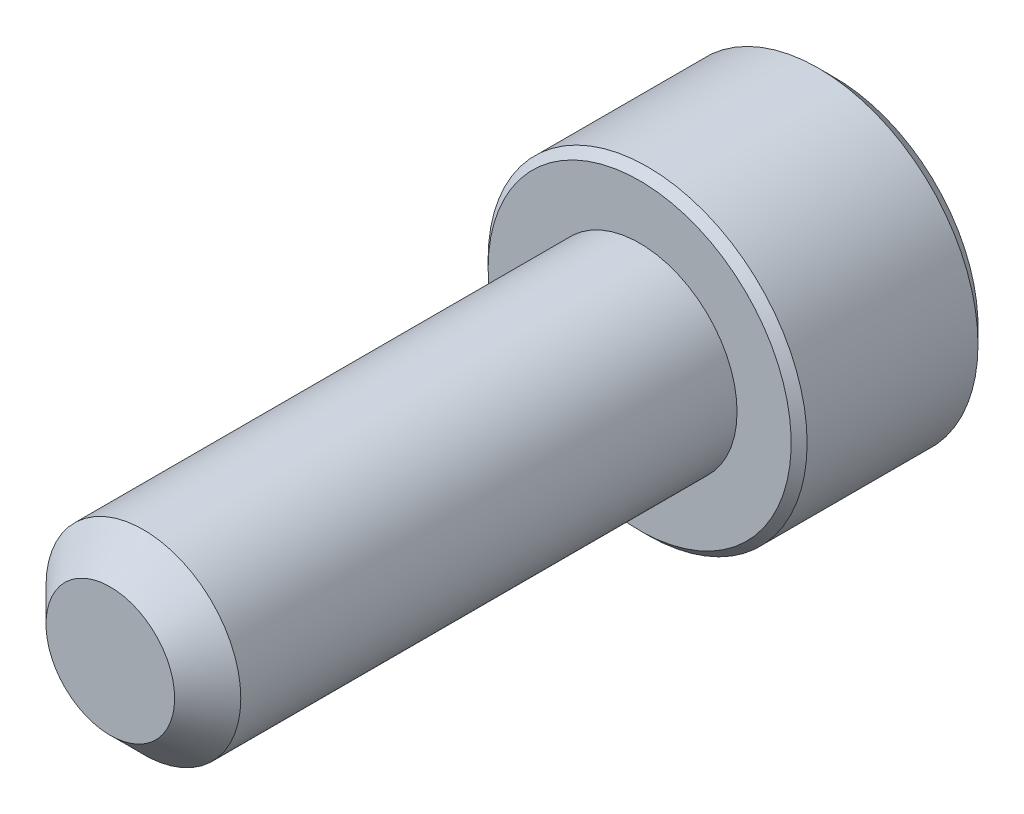
ISO-10303-21;
HEADER;
FILE_DESCRIPTION(('STEP AP214'),'2;1');
FILE_NAME('part.step','',(''),(''),'','','');
FILE_SCHEMA(('AUTOMOTIVE_DESIGN { 1 0 10303 214 1 1 1 1 }'));
ENDSEC;
DATA;
#1=APPLICATION_CONTEXT('core data for automotive mechanical design processes');
#2=APPLICATION_PROTOCOL_DEFINITION('international standard','automotive_design',2000,#1);
#3=PRODUCT_CONTEXT('',#1,'mechanical');
#4=PRODUCT('Part','Part','',(#3));
#5=PRODUCT_RELATED_PRODUCT_CATEGORY('part','',(#4));
#6=PRODUCT_DEFINITION_FORMATION('','',#4);
#7=PRODUCT_DEFINITION_CONTEXT('part definition',#1,'design');
#8=PRODUCT_DEFINITION('design','',#6,#7);
#9=PRODUCT_DEFINITION_SHAPE('','',#8);
#10=(LENGTH_UNIT() NAMED_UNIT(*) SI_UNIT(.MILLI.,.METRE.));
#11=(NAMED_UNIT(*) PLANE_ANGLE_UNIT() SI_UNIT($,.RADIAN.));
#12=(NAMED_UNIT(*) SI_UNIT($,.STERADIAN.) SOLID_ANGLE_UNIT());
#13=UNCERTAINTY_MEASURE_WITH_UNIT(LENGTH_MEASURE(1.E-05),#10,'distance_accuracy_value','');
#14=(GEOMETRIC_REPRESENTATION_CONTEXT(3) GLOBAL_UNCERTAINTY_ASSIGNED_CONTEXT((#13)) GLOBAL_UNIT_ASSIGNED_CONTEXT((#10,
#11,#12)) REPRESENTATION_CONTEXT('',''));
#15=CARTESIAN_POINT('',(0.,0.,0.));
#16=DIRECTION('',(0.,0.,1.));
#17=DIRECTION('',(1.,0.,0.));
#18=AXIS2_PLACEMENT_3D('',#15,#16,#17);
#19=CARTESIAN_POINT('',(0.,0.,-9.525));
#20=DIRECTION('',(0.,0.,1.));
#21=DIRECTION('',(1.,0.,0.));
#22=AXIS2_PLACEMENT_3D('',#19,#20,#21);
#23=CYLINDRICAL_SURFACE('',#22,1.7526);
#24=CARTESIAN_POINT('',(0.,0.,-0.595312499999999));
#25=DIRECTION('',(0.,0.,1.));
#26=DIRECTION('',(1.,0.,0.));
#27=AXIS2_PLACEMENT_3D('',#24,#25,#26);
#28=CIRCLE('',#27,1.7526);
#29=CARTESIAN_POINT('',(1.7526,0.,-0.5953125));
#30=VERTEX_POINT('',#29);
#31=EDGE_CURVE('E108',#30,#30,#28,.F.);
#32=CARTESIAN_POINT('',(0.,0.,-9.525));
#33=DIRECTION('',(0.,0.,-1.));
#34=DIRECTION('',(-1.,0.,0.));
#35=AXIS2_PLACEMENT_3D('',#32,#33,#34);
#36=CIRCLE('',#35,1.7526);
#37=CARTESIAN_POINT('',(1.7526,0.,-9.525));
#38=VERTEX_POINT('',#37);
#39=EDGE_CURVE('E211',#38,#38,#36,.F.);
#40=CARTESIAN_POINT('',(1.7526,0.,-0.5953125));
#41=CARTESIAN_POINT('',(1.7526,0.,-0.688330078125));
#42=CARTESIAN_POINT('',(1.7526,0.,-0.78134765625));
#43=CARTESIAN_POINT('',(1.7526,0.,-0.967382812500001));
#44=CARTESIAN_POINT('',(1.7526,0.,-1.060400390625));
#45=CARTESIAN_POINT('',(1.7526,0.,-1.246435546875));
#46=CARTESIAN_POINT('',(1.7526,0.,-1.339453125));
#47=CARTESIAN_POINT('',(1.7526,0.,-1.52548828125));
#48=CARTESIAN_POINT('',(1.7526,0.,-1.618505859375));
#49=CARTESIAN_POINT('',(1.7526,0.,-1.804541015625));
#50=CARTESIAN_POINT('',(1.7526,0.,-1.89755859375));
#51=CARTESIAN_POINT('',(1.7526,0.,-2.08359375));
#52=CARTESIAN_POINT('',(1.7526,0.,-2.176611328125));
#53=CARTESIAN_POINT('',(1.7526,0.,-2.362646484375));
#54=CARTESIAN_POINT('',(1.7526,0.,-2.4556640625));
#55=CARTESIAN_POINT('',(1.7526,0.,-2.64169921875));
#56=CARTESIAN_POINT('',(1.7526,0.,-2.734716796875));
#57=CARTESIAN_POINT('',(1.7526,0.,-2.920751953125));
#58=CARTESIAN_POINT('',(1.7526,0.,-3.01376953125));
#59=CARTESIAN_POINT('',(1.7526,0.,-3.1998046875));
#60=CARTESIAN_POINT('',(1.7526,0.,-3.292822265625));
#61=CARTESIAN_POINT('',(1.7526,0.,-3.478857421875));
#62=CARTESIAN_POINT('',(1.7526,0.,-3.571875));
#63=CARTESIAN_POINT('',(1.7526,0.,-3.75791015625));
#64=CARTESIAN_POINT('',(1.7526,0.,-3.850927734375));
#65=CARTESIAN_POINT('',(1.7526,0.,-4.036962890625));
#66=CARTESIAN_POINT('',(1.7526,0.,-4.12998046875));
#67=CARTESIAN_POINT('',(1.7526,0.,-4.316015625));
#68=CARTESIAN_POINT('',(1.7526,0.,-4.409033203125));
#69=CARTESIAN_POINT('',(1.7526,0.,-4.595068359375));
#70=CARTESIAN_POINT('',(1.7526,0.,-4.6880859375));
#71=CARTESIAN_POINT('',(1.7526,0.,-4.87412109375));
#72=CARTESIAN_POINT('',(1.7526,0.,-4.967138671875));
#73=CARTESIAN_POINT('',(1.7526,0.,-5.153173828125));
#74=CARTESIAN_POINT('',(1.7526,0.,-5.24619140625));
#75=CARTESIAN_POINT('',(1.7526,0.,-5.4322265625));
#76=CARTESIAN_POINT('',(1.7526,0.,-5.525244140625));
#77=CARTESIAN_POINT('',(1.7526,0.,-5.711279296875));
#78=CARTESIAN_POINT('',(1.7526,0.,-5.804296875));
#79=CARTESIAN_POINT('',(1.7526,0.,-5.99033203125));
#80=CARTESIAN_POINT('',(1.7526,0.,-6.083349609375));
#81=CARTESIAN_POINT('',(1.7526,0.,-6.269384765625));
#82=CARTESIAN_POINT('',(1.7526,0.,-6.36240234375));
#83=CARTESIAN_POINT('',(1.7526,0.,-6.5484375));
#84=CARTESIAN_POINT('',(1.7526,0.,-6.641455078125));
#85=CARTESIAN_POINT('',(1.7526,0.,-6.827490234375));
#86=CARTESIAN_POINT('',(1.7526,0.,-6.9205078125));
#87=CARTESIAN_POINT('',(1.7526,0.,-7.10654296875));
#88=CARTESIAN_POINT('',(1.7526,0.,-7.199560546875));
#89=CARTESIAN_POINT('',(1.7526,0.,-7.385595703125));
#90=CARTESIAN_POINT('',(1.7526,0.,-7.47861328125));
#91=CARTESIAN_POINT('',(1.7526,0.,-7.6646484375));
#92=CARTESIAN_POINT('',(1.7526,0.,-7.757666015625));
#93=CARTESIAN_POINT('',(1.7526,0.,-7.943701171875));
#94=CARTESIAN_POINT('',(1.7526,0.,-8.03671875));
#95=CARTESIAN_POINT('',(1.7526,0.,-8.22275390625));
#96=CARTESIAN_POINT('',(1.7526,0.,-8.315771484375));
#97=CARTESIAN_POINT('',(1.7526,0.,-8.501806640625));
#98=CARTESIAN_POINT('',(1.7526,0.,-8.59482421875));
#99=CARTESIAN_POINT('',(1.7526,0.,-8.780859375));
#100=CARTESIAN_POINT('',(1.7526,0.,-8.873876953125));
#101=CARTESIAN_POINT('',(1.7526,0.,-9.059912109375));
#102=CARTESIAN_POINT('',(1.7526,0.,-9.1529296875));
#103=CARTESIAN_POINT('',(1.7526,0.,-9.33896484375));
#104=CARTESIAN_POINT('',(1.7526,0.,-9.431982421875));
#105=CARTESIAN_POINT('',(1.7526,0.,-9.525));
#106=B_SPLINE_CURVE_WITH_KNOTS('',3,(#40,#41,#42,#43,#44,#45,#46,#47,#48,#49,#50,#51,#52,#53,
#54,#55,#56,#57,#58,#59,#60,#61,#62,#63,#64,#65,#66,#67,#68,#69,#70,#71,#72,#73,#74,#75,#76,#77,
#78,#79,#80,#81,#82,#83,#84,#85,#86,#87,#88,#89,#90,#91,#92,#93,#94,#95,#96,#97,#98,#99,#100,
#101,#102,#103,#104,#105),.UNSPECIFIED.,.F.,.F.,(4,2,2,2,2,2,2,2,2,2,2,2,2,2,2,2,2,2,2,2,2,2,2,
2,2,2,2,2,2,2,2,2,4),(0.,0.279052734375,0.55810546875,0.837158203125,1.1162109375,
1.395263671875,1.67431640625,1.953369140625,2.232421875,2.511474609375,2.79052734375,
3.069580078125,3.3486328125,3.627685546875,3.90673828125,4.185791015625,4.46484375,
4.743896484375,5.02294921875,5.302001953125,5.5810546875,5.860107421875,6.13916015625,
6.418212890625,6.697265625,6.976318359375,7.25537109375,7.534423828125,7.8134765625,
8.092529296875,8.37158203125,8.650634765625,8.9296875),.UNSPECIFIED.);
#107=EDGE_CURVE('BSEAM34',#30,#38,#106,.T.);
#108=ORIENTED_EDGE('',*,*,#31,.T.);
#109=ORIENTED_EDGE('',*,*,#39,.T.);
#110=ORIENTED_EDGE('',*,*,#107,.T.);
#111=ORIENTED_EDGE('',*,*,#107,.F.);
#112=EDGE_LOOP('',(#108,#110,#109,#111));
#113=FACE_BOUND('',#112,.T.);
#114=ADVANCED_FACE('F34',(#113),#23,.T.);
#115=CARTESIAN_POINT('',(0.,0.,0.));
#116=DIRECTION('',(0.,0.,1.));
#117=DIRECTION('',(1.,0.,0.));
#118=AXIS2_PLACEMENT_3D('',#115,#116,#117);
#119=PLANE('',#118);
#120=CARTESIAN_POINT('',(0.,0.,0.));
#121=DIRECTION('',(0.,0.,1.));
#122=DIRECTION('',(1.,0.,0.));
#123=AXIS2_PLACEMENT_3D('',#120,#121,#122);
#124=CIRCLE('',#123,1.1572875);
#125=CARTESIAN_POINT('',(1.1572875,0.,0.));
#126=VERTEX_POINT('',#125);
#127=EDGE_CURVE('E210',#126,#126,#124,.T.);
#128=ORIENTED_EDGE('',*,*,#127,.T.);
#129=EDGE_LOOP('',(#128));
#130=FACE_BOUND('',#129,.T.);
#131=ADVANCED_FACE('F188',(#130),#119,.T.);
#132=CARTESIAN_POINT('',(0.,0.,0.));
#133=DIRECTION('',(0.,0.,-1.));
#134=DIRECTION('',(-1.,0.,0.));
#135=AXIS2_PLACEMENT_3D('',#132,#133,#134);
#136=CONICAL_SURFACE('',#135,1.1572875,0.78539816339745);
#137=ORIENTED_EDGE('',*,*,#31,.F.);
#138=EDGE_LOOP('',(#137));
#139=FACE_BOUND('',#138,.T.);
#140=ORIENTED_EDGE('',*,*,#127,.F.);
#141=EDGE_LOOP('',(#140));
#142=FACE_BOUND('',#141,.T.);
#143=ADVANCED_FACE('F194',(#139,#142),#136,.T.);
#144=CARTESIAN_POINT('',(0.,0.,-13.0302));
#145=DIRECTION('',(0.,0.,1.));
#146=DIRECTION('',(1.,0.,0.));
#147=AXIS2_PLACEMENT_3D('',#144,#145,#146);
#148=CYLINDRICAL_SURFACE('',#147,2.8702);
#149=CARTESIAN_POINT('',(0.,0.,-9.66851));
#150=DIRECTION('',(0.,0.,-1.));
#151=DIRECTION('',(-1.,0.,0.));
#152=AXIS2_PLACEMENT_3D('',#149,#150,#151);
#153=CIRCLE('',#152,2.8702);
#154=CARTESIAN_POINT('',(-2.8702,0.,-9.66851));
#155=VERTEX_POINT('',#154);
#156=EDGE_CURVE('E42',#155,#155,#153,.T.);
#157=ORIENTED_EDGE('',*,*,#156,.T.);
#158=EDGE_LOOP('',(#157));
#159=FACE_BOUND('',#158,.T.);
#160=CARTESIAN_POINT('',(0.,0.,-12.74318));
#161=DIRECTION('',(0.,0.,-1.));
#162=DIRECTION('',(-1.,0.,0.));
#163=AXIS2_PLACEMENT_3D('',#160,#161,#162);
#164=CIRCLE('',#163,2.8702);
#165=CARTESIAN_POINT('',(-2.8702,0.,-12.74318));
#166=VERTEX_POINT('',#165);
#167=EDGE_CURVE('E171',#166,#166,#164,.F.);
#168=ORIENTED_EDGE('',*,*,#167,.T.);
#169=EDGE_LOOP('',(#168));
#170=FACE_BOUND('',#169,.T.);
#171=ADVANCED_FACE('F176',(#159,#170),#148,.T.);
#172=CARTESIAN_POINT('',(0.,0.,-13.0302));
#173=DIRECTION('',(0.,0.,-1.));
#174=DIRECTION('',(-1.,0.,0.));
#175=AXIS2_PLACEMENT_3D('',#172,#173,#174);
#176=PLANE('',#175);
#177=CARTESIAN_POINT('',(0.,0.,-13.0302));
#178=DIRECTION('',(0.,0.,-1.));
#179=DIRECTION('',(-1.,0.,0.));
#180=AXIS2_PLACEMENT_3D('',#177,#178,#179);
#181=CIRCLE('',#180,2.58317999999999);
#182=CARTESIAN_POINT('',(-2.58317999999999,0.,-13.0302));
#183=VERTEX_POINT('',#182);
#184=EDGE_CURVE('E107',#183,#183,#181,.T.);
#185=ORIENTED_EDGE('',*,*,#184,.T.);
#186=EDGE_LOOP('',(#185));
#187=FACE_BOUND('',#186,.T.);
#188=CARTESIAN_POINT('',(0.,0.,-13.0302));
#189=DIRECTION('',(0.,0.,-1.));
#190=DIRECTION('',(-1.,0.,0.));
#191=AXIS2_PLACEMENT_3D('',#188,#189,#190);
#192=CIRCLE('',#191,1.60395121659243);
#193=CARTESIAN_POINT('',(-1.3890625,0.801975608296215,-13.0302));
#194=VERTEX_POINT('',#193);
#195=CARTESIAN_POINT('',(0.,1.60395121659243,-13.0302));
#196=VERTEX_POINT('',#195);
#197=EDGE_CURVE('E88',#194,#196,#192,.T.);
#198=ORIENTED_EDGE('',*,*,#197,.F.);
#199=CARTESIAN_POINT('',(-1.3890625,-0.801975608296215,-13.0302));
#200=VERTEX_POINT('',#199);
#201=EDGE_CURVE('E48',#200,#194,#192,.T.);
#202=ORIENTED_EDGE('',*,*,#201,.F.);
#203=CARTESIAN_POINT('',(0.,-1.60395121659243,-13.0302));
#204=VERTEX_POINT('',#203);
#205=EDGE_CURVE('E270',#204,#200,#192,.T.);
#206=ORIENTED_EDGE('',*,*,#205,.F.);
#207=CARTESIAN_POINT('',(1.3890625,-0.801975608296214,-13.0302));
#208=VERTEX_POINT('',#207);
#209=EDGE_CURVE('E55',#208,#204,#192,.T.);
#210=ORIENTED_EDGE('',*,*,#209,.F.);
#211=CARTESIAN_POINT('',(1.3890625,0.801975608296215,-13.0302));
#212=VERTEX_POINT('',#211);
#213=EDGE_CURVE('E129',#212,#208,#192,.T.);
#214=ORIENTED_EDGE('',*,*,#213,.F.);
#215=EDGE_CURVE('E97',#196,#212,#192,.T.);
#216=ORIENTED_EDGE('',*,*,#215,.F.);
#217=EDGE_LOOP('',(#198,#202,#206,#210,#214,#216));
#218=FACE_BOUND('',#217,.T.);
#219=ADVANCED_FACE('F128',(#187,#218),#176,.T.);
#220=CARTESIAN_POINT('',(0.,0.,-9.525));
#221=DIRECTION('',(0.,0.,-1.));
#222=DIRECTION('',(-1.,0.,0.));
#223=AXIS2_PLACEMENT_3D('',#220,#221,#222);
#224=PLANE('',#223);
#225=CARTESIAN_POINT('',(0.,0.,-9.525));
#226=DIRECTION('',(0.,0.,-1.));
#227=DIRECTION('',(-1.,0.,0.));
#228=AXIS2_PLACEMENT_3D('',#225,#226,#227);
#229=CIRCLE('',#228,2.72669);
#230=CARTESIAN_POINT('',(-2.72669,0.,-9.525));
#231=VERTEX_POINT('',#230);
#232=EDGE_CURVE('E11',#231,#231,#229,.F.);
#233=ORIENTED_EDGE('',*,*,#232,.T.);
#234=EDGE_LOOP('',(#233));
#235=FACE_BOUND('',#234,.T.);
#236=ORIENTED_EDGE('',*,*,#39,.F.);
#237=EDGE_LOOP('',(#236));
#238=FACE_BOUND('',#237,.T.);
#239=ADVANCED_FACE('F282',(#235,#238),#224,.F.);
#240=CARTESIAN_POINT('',(0.,0.,-13.0302));
#241=DIRECTION('',(0.,0.,-1.));
#242=DIRECTION('',(-1.,0.,0.));
#243=AXIS2_PLACEMENT_3D('',#240,#241,#242);
#244=CONICAL_SURFACE('',#243,1.60395121659243,0.78539816339745);
#245=ORIENTED_EDGE('',*,*,#215,.T.);
#246=CARTESIAN_POINT('',(-0.000199999999999834,1.60406668664627,-13.0303154825221));
#247=CARTESIAN_POINT('',(0.0475548148995859,1.57649543140889,-13.0027647868811));
#248=CARTESIAN_POINT('',(0.0961082129767676,1.54846311395896,-12.9768319141145));
#249=CARTESIAN_POINT('',(0.195114281423185,1.49130193369001,-12.9293489608708));
#250=CARTESIAN_POINT('',(0.245576372730141,1.46216763169007,-12.9078253080794));
#251=CARTESIAN_POINT('',(0.34733083528491,1.40341966534283,-12.8709546019866));
#252=CARTESIAN_POINT('',(0.398597278416376,1.37382097060048,-12.8555148513149));
#253=CARTESIAN_POINT('',(0.502259069123939,1.31397180783079,-12.8317264581829));
#254=CARTESIAN_POINT('',(0.554651247789434,1.28372316937484,-12.8233600517165));
#255=CARTESIAN_POINT('',(0.644944084544837,1.23159257576821,-12.8158113663708));
#256=CARTESIAN_POINT('',(0.682728034255603,1.20977800223165,-12.8146936971037));
#257=CARTESIAN_POINT('',(0.758229287800439,1.16618733317339,-12.8165750513552));
#258=CARTESIAN_POINT('',(0.79594657508652,1.14441124720567,-12.8195749834252));
#259=CARTESIAN_POINT('',(0.871018018906522,1.10106872890773,-12.8295189567457));
#260=CARTESIAN_POINT('',(0.908371804329555,1.07950251083849,-12.8364666704902));
#261=CARTESIAN_POINT('',(0.982452435596042,1.03673203843505,-12.8539288810594));
#262=CARTESIAN_POINT('',(1.01917900521513,1.01552794357906,-12.8644449088769));
#263=CARTESIAN_POINT('',(1.11325413716704,0.961213640822577,-12.8956664203823));
#264=CARTESIAN_POINT('',(1.17001916310317,0.928440337817794,-12.9187263608604));
#265=CARTESIAN_POINT('',(1.25348479270274,0.880251434100402,-12.9576547118295));
#266=CARTESIAN_POINT('',(1.28098915116073,0.86437178534079,-12.9713318145832));
#267=CARTESIAN_POINT('',(1.33549195495674,0.832904576897576,-12.9999348081189));
#268=CARTESIAN_POINT('',(1.36249063449213,0.817316882000056,-13.0148601023926));
#269=CARTESIAN_POINT('',(1.3892625,0.801860138242377,-13.0303154825221));
#270=B_SPLINE_CURVE_WITH_KNOTS('',3,(#246,#247,#248,#249,#250,#251,#252,#253,#254,#255,#256,
#257,#258,#259,#260,#261,#262,#263,#264,#265,#266,#267,#268,#269),.UNSPECIFIED.,.F.,.F.,(4,2,2,
2,2,2,2,2,2,2,2,4),(0.,0.185054161583332,0.371186974731966,0.554362620151554,0.737076859824674,
0.867821902366108,0.998595798526819,1.12949154907137,1.26044353188444,1.46846066168042,
1.57218026599103,1.67585058309997),.UNSPECIFIED.);
#271=EDGE_CURVE('E102',#196,#212,#270,.T.);
#272=ORIENTED_EDGE('',*,*,#271,.F.);
#273=EDGE_LOOP('',(#245,#272));
#274=FACE_BOUND('',#273,.T.);
#275=ADVANCED_FACE('F103',(#274),#244,.F.);
#276=ORIENTED_EDGE('',*,*,#213,.T.);
#277=CARTESIAN_POINT('',(1.3890625,-1.59946669533747,-13.5446888553473));
#278=CARTESIAN_POINT('',(1.3890625,-1.56052074100157,-13.5152883204447));
#279=CARTESIAN_POINT('',(1.3890625,-1.52135778101398,-13.4861760571059));
#280=CARTESIAN_POINT('',(1.3890625,-1.44250974368035,-13.4286471018554));
#281=CARTESIAN_POINT('',(1.3890625,-1.40282453775616,-13.4002305863579));
#282=CARTESIAN_POINT('',(1.3890625,-1.28227261747607,-13.3157979106091));
#283=CARTESIAN_POINT('',(1.3890625,-1.20050167441145,-13.2610513931364));
#284=CARTESIAN_POINT('',(1.3890625,-1.0290311937974,-13.1535774539605));
#285=CARTESIAN_POINT('',(1.3890625,-0.939145510476103,-13.1011436435155));
#286=CARTESIAN_POINT('',(1.3890625,-0.754884542278012,-13.0052310286316));
#287=CARTESIAN_POINT('',(1.3890625,-0.660525767721076,-12.9617220353823));
#288=CARTESIAN_POINT('',(1.3890625,-0.518892422901336,-12.9084928148428));
#289=CARTESIAN_POINT('',(1.3890625,-0.473714746794419,-12.8932156455446));
#290=CARTESIAN_POINT('',(1.3890625,-0.382268722235191,-12.8662883218985));
#291=CARTESIAN_POINT('',(1.3890625,-0.336000298881662,-12.8546384174186));
#292=CARTESIAN_POINT('',(1.3890625,-0.243422308835822,-12.8357647672582));
#293=CARTESIAN_POINT('',(1.3890625,-0.197128447486238,-12.8284651868372));
#294=CARTESIAN_POINT('',(1.3890625,-0.104045636784198,-12.818434703163));
#295=CARTESIAN_POINT('',(1.3890625,-0.0572567739284931,-12.8157030145629));
#296=CARTESIAN_POINT('',(1.3890625,0.0346588401718091,-12.8150109514094));
#297=CARTESIAN_POINT('',(1.3890625,0.0797843745088175,-12.8168812460884));
#298=CARTESIAN_POINT('',(1.3890625,0.169653022605208,-12.8249168656859));
#299=CARTESIAN_POINT('',(1.3890625,0.214396061393213,-12.8310830139257));
#300=CARTESIAN_POINT('',(1.3890625,0.303926740576741,-12.8474783142406));
#301=CARTESIAN_POINT('',(1.3890625,0.348701560562637,-12.8577764230037));
#302=CARTESIAN_POINT('',(1.3890625,0.437272889801829,-12.8818883282635));
#303=CARTESIAN_POINT('',(1.3890625,0.481069480580726,-12.8957018305893));
#304=CARTESIAN_POINT('',(1.3890625,0.618958177531063,-12.9443885558667));
#305=CARTESIAN_POINT('',(1.3890625,0.711087679809601,-12.9848066296314));
#306=CARTESIAN_POINT('',(1.3890625,0.891018647016391,-13.0746712938188));
#307=CARTESIAN_POINT('',(1.3890625,0.978803075143675,-13.1241503209353));
#308=CARTESIAN_POINT('',(1.3890625,1.14657176186197,-13.2262299189673));
#309=CARTESIAN_POINT('',(1.3890625,1.22672686003424,-13.2785531888122));
#310=CARTESIAN_POINT('',(1.3890625,1.34481925924245,-13.3594395512885));
#311=CARTESIAN_POINT('',(1.3890625,1.38367371461019,-13.3866868720938));
#312=CARTESIAN_POINT('',(1.3890625,1.46085170378017,-13.4419021635328));
#313=CARTESIAN_POINT('',(1.3890625,1.49917537967343,-13.4698699353332));
#314=CARTESIAN_POINT('',(1.3890625,1.53727804285926,-13.4981364275532));
#315=B_SPLINE_CURVE_WITH_KNOTS('',3,(#277,#278,#279,#280,#281,#282,#283,#284,#285,#286,#287,
#288,#289,#290,#291,#292,#293,#294,#295,#296,#297,#298,#299,#300,#301,#302,#303,#304,#305,#306,
#307,#308,#309,#310,#311,#312,#313,#314),.UNSPECIFIED.,.F.,.F.,(4,2,2,2,2,2,2,2,2,2,2,2,2,2,2,2,
2,2,4),(0.,0.146388252251747,0.292813246205363,0.587897938676557,0.899825715593295,
1.21068031322194,1.35363178607714,1.49659310411811,1.6369833143961,1.77734938523477,
1.91262840625218,2.04793336128669,2.18559709790565,2.32324931849741,2.62418012481466,
2.92621005486572,3.2132312503121,3.35559422447357,3.49791832091463),.UNSPECIFIED.);
#316=EDGE_CURVE('E96',#212,#208,#315,.F.);
#317=ORIENTED_EDGE('',*,*,#316,.F.);
#318=EDGE_LOOP('',(#276,#317));
#319=FACE_BOUND('',#318,.T.);
#320=ADVANCED_FACE('F276',(#319),#244,.F.);
#321=ORIENTED_EDGE('',*,*,#209,.T.);
#322=CARTESIAN_POINT('',(1.3892625,-0.801860138242377,-13.0303154825221));
#323=CARTESIAN_POINT('',(1.34150768510041,-0.829431393479753,-13.0027647868811));
#324=CARTESIAN_POINT('',(1.29295428702323,-0.857463710929685,-12.9768319141145));
#325=CARTESIAN_POINT('',(1.19394821857682,-0.914624891198631,-12.9293489608708));
#326=CARTESIAN_POINT('',(1.14348612726986,-0.943759193198573,-12.9078253080794));
#327=CARTESIAN_POINT('',(1.04173166471509,-1.00250715954581,-12.8709546019866));
#328=CARTESIAN_POINT('',(0.990465221583624,-1.03210585428816,-12.8555148513149));
#329=CARTESIAN_POINT('',(0.886803430876061,-1.09195501705785,-12.8317264581829));
#330=CARTESIAN_POINT('',(0.834411252210567,-1.12220365551381,-12.8233600517165));
#331=CARTESIAN_POINT('',(0.744118415455164,-1.17433424912043,-12.8158113663708));
#332=CARTESIAN_POINT('',(0.706334465744398,-1.19614882265699,-12.8146936971037));
#333=CARTESIAN_POINT('',(0.630833212199561,-1.23973949171526,-12.8165750513552));
#334=CARTESIAN_POINT('',(0.593115924913481,-1.26151557768298,-12.8195749834252));
#335=CARTESIAN_POINT('',(0.518044481093479,-1.30485809598091,-12.8295189567457));
#336=CARTESIAN_POINT('',(0.480690695670446,-1.32642431405015,-12.8364666704902));
#337=CARTESIAN_POINT('',(0.406610064403959,-1.36919478645359,-12.8539288810594));
#338=CARTESIAN_POINT('',(0.369883494784871,-1.39039888130958,-12.8644449088769));
#339=CARTESIAN_POINT('',(0.275808362832965,-1.44471318406607,-12.8956664203823));
#340=CARTESIAN_POINT('',(0.219043336896831,-1.47748648707085,-12.9187263608604));
#341=CARTESIAN_POINT('',(0.135577707297264,-1.52567539078824,-12.9576547118295));
#342=CARTESIAN_POINT('',(0.108073348839267,-1.54155503954785,-12.9713318145832));
#343=CARTESIAN_POINT('',(0.0535705450432613,-1.57302224799107,-12.9999348081189));
#344=CARTESIAN_POINT('',(0.0265718655078732,-1.58860994288859,-13.0148601023926));
#345=CARTESIAN_POINT('',(-0.000199999999999489,-1.60406668664627,-13.0303154825221));
#346=B_SPLINE_CURVE_WITH_KNOTS('',3,(#322,#323,#324,#325,#326,#327,#328,#329,#330,#331,#332,
#333,#334,#335,#336,#337,#338,#339,#340,#341,#342,#343,#344,#345),.UNSPECIFIED.,.F.,.F.,(4,2,2,
2,2,2,2,2,2,2,2,4),(0.,0.185054161583332,0.371186974731966,0.554362620151553,0.737076859824674,
0.867821902366108,0.998595798526818,1.12949154907136,1.26044353188444,1.46846066168042,
1.57218026599104,1.67585058309997),.UNSPECIFIED.);
#347=EDGE_CURVE('E139',#208,#204,#346,.T.);
#348=ORIENTED_EDGE('',*,*,#347,.F.);
#349=EDGE_LOOP('',(#321,#348));
#350=FACE_BOUND('',#349,.T.);
#351=ADVANCED_FACE('F273',(#350),#244,.F.);
#352=ORIENTED_EDGE('',*,*,#205,.T.);
#353=CARTESIAN_POINT('',(0.000200000000000174,-1.60406668664627,-13.0303154825221));
#354=CARTESIAN_POINT('',(-0.0475548148995862,-1.57649543140889,-13.0027647868811));
#355=CARTESIAN_POINT('',(-0.0961082129767681,-1.54846311395896,-12.9768319141145));
#356=CARTESIAN_POINT('',(-0.195114281423185,-1.49130193369001,-12.9293489608708));
#357=CARTESIAN_POINT('',(-0.245576372730141,-1.46216763169007,-12.9078253080794));
#358=CARTESIAN_POINT('',(-0.34733083528491,-1.40341966534283,-12.8709546019866));
#359=CARTESIAN_POINT('',(-0.398597278416376,-1.37382097060048,-12.8555148513149));
#360=CARTESIAN_POINT('',(-0.502259069123939,-1.31397180783079,-12.8317264581829));
#361=CARTESIAN_POINT('',(-0.554651247789433,-1.28372316937484,-12.8233600517165));
#362=CARTESIAN_POINT('',(-0.644944084544836,-1.23159257576821,-12.8158113663708));
#363=CARTESIAN_POINT('',(-0.682728034255602,-1.20977800223165,-12.8146936971037));
#364=CARTESIAN_POINT('',(-0.758229287800438,-1.16618733317339,-12.8165750513552));
#365=CARTESIAN_POINT('',(-0.795946575086519,-1.14441124720567,-12.8195749834252));
#366=CARTESIAN_POINT('',(-0.871018018906522,-1.10106872890773,-12.8295189567457));
#367=CARTESIAN_POINT('',(-0.908371804329555,-1.07950251083849,-12.8364666704902));
#368=CARTESIAN_POINT('',(-0.982452435596042,-1.03673203843505,-12.8539288810594));
#369=CARTESIAN_POINT('',(-1.01917900521513,-1.01552794357906,-12.8644449088769));
#370=CARTESIAN_POINT('',(-1.11325413716704,-0.961213640822577,-12.8956664203823));
#371=CARTESIAN_POINT('',(-1.17001916310317,-0.928440337817794,-12.9187263608604));
#372=CARTESIAN_POINT('',(-1.25348479270274,-0.880251434100402,-12.9576547118295));
#373=CARTESIAN_POINT('',(-1.28098915116073,-0.86437178534079,-12.9713318145832));
#374=CARTESIAN_POINT('',(-1.33549195495674,-0.832904576897576,-12.9999348081189));
#375=CARTESIAN_POINT('',(-1.36249063449213,-0.817316882000055,-13.0148601023926));
#376=CARTESIAN_POINT('',(-1.3892625,-0.801860138242377,-13.0303154825221));
#377=B_SPLINE_CURVE_WITH_KNOTS('',3,(#353,#354,#355,#356,#357,#358,#359,#360,#361,#362,#363,
#364,#365,#366,#367,#368,#369,#370,#371,#372,#373,#374,#375,#376),.UNSPECIFIED.,.F.,.F.,(4,2,2,
2,2,2,2,2,2,2,2,4),(0.,0.185054161583333,0.371186974731967,0.554362620151554,0.737076859824674,
0.867821902366108,0.998595798526819,1.12949154907137,1.26044353188444,1.46846066168042,
1.57218026599104,1.67585058309997),.UNSPECIFIED.);
#378=EDGE_CURVE('E247',#204,#200,#377,.T.);
#379=ORIENTED_EDGE('',*,*,#378,.F.);
#380=EDGE_LOOP('',(#352,#379));
#381=FACE_BOUND('',#380,.T.);
#382=ADVANCED_FACE('F272',(#381),#244,.F.);
#383=ORIENTED_EDGE('',*,*,#201,.T.);
#384=CARTESIAN_POINT('',(-1.3890625,-1.59946669533747,-13.5446888553473));
#385=CARTESIAN_POINT('',(-1.3890625,-1.56052074100157,-13.5152883204447));
#386=CARTESIAN_POINT('',(-1.3890625,-1.52135778101398,-13.4861760571059));
#387=CARTESIAN_POINT('',(-1.3890625,-1.44250974368035,-13.4286471018554));
#388=CARTESIAN_POINT('',(-1.3890625,-1.40282453775616,-13.4002305863579));
#389=CARTESIAN_POINT('',(-1.3890625,-1.28227261747607,-13.3157979106091));
#390=CARTESIAN_POINT('',(-1.3890625,-1.20050167441145,-13.2610513931364));
#391=CARTESIAN_POINT('',(-1.3890625,-1.0290311937974,-13.1535774539605));
#392=CARTESIAN_POINT('',(-1.3890625,-0.939145510476106,-13.1011436435155));
#393=CARTESIAN_POINT('',(-1.3890625,-0.754884542278015,-13.0052310286316));
#394=CARTESIAN_POINT('',(-1.3890625,-0.660525767721078,-12.9617220353823));
#395=CARTESIAN_POINT('',(-1.3890625,-0.518892422901337,-12.9084928148428));
#396=CARTESIAN_POINT('',(-1.3890625,-0.473714746794421,-12.8932156455446));
#397=CARTESIAN_POINT('',(-1.3890625,-0.382268722235192,-12.8662883218985));
#398=CARTESIAN_POINT('',(-1.3890625,-0.336000298881664,-12.8546384174186));
#399=CARTESIAN_POINT('',(-1.3890625,-0.243422308835824,-12.8357647672582));
#400=CARTESIAN_POINT('',(-1.3890625,-0.197128447486239,-12.8284651868372));
#401=CARTESIAN_POINT('',(-1.3890625,-0.104045636784198,-12.818434703163));
#402=CARTESIAN_POINT('',(-1.3890625,-0.0572567739284929,-12.8157030145629));
#403=CARTESIAN_POINT('',(-1.3890625,0.0346588401718094,-12.8150109514094));
#404=CARTESIAN_POINT('',(-1.3890625,0.0797843745088178,-12.8168812460884));
#405=CARTESIAN_POINT('',(-1.3890625,0.169653022605209,-12.8249168656859));
#406=CARTESIAN_POINT('',(-1.3890625,0.214396061393213,-12.8310830139257));
#407=CARTESIAN_POINT('',(-1.3890625,0.303926740576741,-12.8474783142406));
#408=CARTESIAN_POINT('',(-1.3890625,0.348701560562638,-12.8577764230037));
#409=CARTESIAN_POINT('',(-1.3890625,0.437272889801829,-12.8818883282635));
#410=CARTESIAN_POINT('',(-1.3890625,0.481069480580726,-12.8957018305893));
#411=CARTESIAN_POINT('',(-1.3890625,0.618958177531064,-12.9443885558667));
#412=CARTESIAN_POINT('',(-1.3890625,0.711087679809601,-12.9848066296314));
#413=CARTESIAN_POINT('',(-1.3890625,0.891018647016393,-13.0746712938188));
#414=CARTESIAN_POINT('',(-1.3890625,0.978803075143676,-13.1241503209353));
#415=CARTESIAN_POINT('',(-1.3890625,1.14657176186197,-13.2262299189673));
#416=CARTESIAN_POINT('',(-1.3890625,1.22672686003424,-13.2785531888122));
#417=CARTESIAN_POINT('',(-1.3890625,1.34481925924245,-13.3594395512885));
#418=CARTESIAN_POINT('',(-1.3890625,1.3836737146102,-13.3866868720938));
#419=CARTESIAN_POINT('',(-1.3890625,1.46085170378018,-13.4419021635328));
#420=CARTESIAN_POINT('',(-1.3890625,1.49917537967343,-13.4698699353332));
#421=CARTESIAN_POINT('',(-1.3890625,1.53727804285926,-13.4981364275532));
#422=B_SPLINE_CURVE_WITH_KNOTS('',3,(#384,#385,#386,#387,#388,#389,#390,#391,#392,#393,#394,
#395,#396,#397,#398,#399,#400,#401,#402,#403,#404,#405,#406,#407,#408,#409,#410,#411,#412,#413,
#414,#415,#416,#417,#418,#419,#420,#421),.UNSPECIFIED.,.F.,.F.,(4,2,2,2,2,2,2,2,2,2,2,2,2,2,2,2,
2,2,4),(0.,0.146388252251748,0.292813246205363,0.587897938676555,0.899825715593293,
1.21068031322194,1.35363178607714,1.49659310411811,1.6369833143961,1.77734938523478,
1.91262840625218,2.04793336128669,2.18559709790565,2.32324931849741,2.62418012481466,
2.92621005486573,3.2132312503121,3.35559422447358,3.49791832091463),.UNSPECIFIED.);
#423=EDGE_CURVE('E118',#200,#194,#422,.T.);
#424=ORIENTED_EDGE('',*,*,#423,.F.);
#425=EDGE_LOOP('',(#383,#424));
#426=FACE_BOUND('',#425,.T.);
#427=ADVANCED_FACE('F289',(#426),#244,.F.);
#428=ORIENTED_EDGE('',*,*,#197,.T.);
#429=CARTESIAN_POINT('',(-1.3892625,0.801860138242377,-13.0303154825221));
#430=CARTESIAN_POINT('',(-1.34150768510041,0.829431393479754,-13.0027647868811));
#431=CARTESIAN_POINT('',(-1.29295428702323,0.857463710929686,-12.9768319141145));
#432=CARTESIAN_POINT('',(-1.19394821857681,0.914624891198631,-12.9293489608708));
#433=CARTESIAN_POINT('',(-1.14348612726986,0.943759193198574,-12.9078253080794));
#434=CARTESIAN_POINT('',(-1.04173166471509,1.00250715954582,-12.8709546019866));
#435=CARTESIAN_POINT('',(-0.990465221583623,1.03210585428816,-12.8555148513149));
#436=CARTESIAN_POINT('',(-0.886803430876061,1.09195501705785,-12.8317264581829));
#437=CARTESIAN_POINT('',(-0.834411252210566,1.12220365551381,-12.8233600517165));
#438=CARTESIAN_POINT('',(-0.744118415455164,1.17433424912043,-12.8158113663708));
#439=CARTESIAN_POINT('',(-0.706334465744397,1.19614882265699,-12.8146936971037));
#440=CARTESIAN_POINT('',(-0.630833212199561,1.23973949171526,-12.8165750513552));
#441=CARTESIAN_POINT('',(-0.59311592491348,1.26151557768298,-12.8195749834252));
#442=CARTESIAN_POINT('',(-0.518044481093478,1.30485809598091,-12.8295189567457));
#443=CARTESIAN_POINT('',(-0.480690695670445,1.32642431405015,-12.8364666704902));
#444=CARTESIAN_POINT('',(-0.406610064403958,1.36919478645359,-12.8539288810594));
#445=CARTESIAN_POINT('',(-0.36988349478487,1.39039888130958,-12.8644449088769));
#446=CARTESIAN_POINT('',(-0.275808362832964,1.44471318406607,-12.8956664203823));
#447=CARTESIAN_POINT('',(-0.21904333689683,1.47748648707085,-12.9187263608604));
#448=CARTESIAN_POINT('',(-0.135577707297263,1.52567539078824,-12.9576547118295));
#449=CARTESIAN_POINT('',(-0.108073348839267,1.54155503954785,-12.9713318145832));
#450=CARTESIAN_POINT('',(-0.0535705450432607,1.57302224799107,-12.9999348081189));
#451=CARTESIAN_POINT('',(-0.0265718655078727,1.58860994288859,-13.0148601023926));
#452=CARTESIAN_POINT('',(0.000199999999999812,1.60406668664627,-13.0303154825221));
#453=B_SPLINE_CURVE_WITH_KNOTS('',3,(#429,#430,#431,#432,#433,#434,#435,#436,#437,#438,#439,
#440,#441,#442,#443,#444,#445,#446,#447,#448,#449,#450,#451,#452),.UNSPECIFIED.,.F.,.F.,(4,2,2,
2,2,2,2,2,2,2,2,4),(0.,0.185054161583332,0.371186974731966,0.554362620151554,0.737076859824674,
0.867821902366108,0.998595798526818,1.12949154907136,1.26044353188444,1.46846066168042,
1.57218026599103,1.67585058309997),.UNSPECIFIED.);
#454=EDGE_CURVE('E92',#194,#196,#453,.T.);
#455=ORIENTED_EDGE('',*,*,#454,.F.);
#456=EDGE_LOOP('',(#428,#455));
#457=FACE_BOUND('',#456,.T.);
#458=ADVANCED_FACE('F90',(#457),#244,.F.);
#459=CARTESIAN_POINT('',(1.3890625,2.40592682488864,-10.94660625));
#460=DIRECTION('',(0.,0.,-1.));
#461=DIRECTION('',(-1.,0.,0.));
#462=AXIS2_PLACEMENT_3D('',#459,#460,#461);
#463=PLANE('',#462);
#464=DIRECTION('',(0.866025403784439,0.5,0.));
#465=VECTOR('',#464,1.);
#466=CARTESIAN_POINT('',(-1.3890625,0.801975608296215,-10.94660625));
#467=LINE('',#466,#465);
#468=CARTESIAN_POINT('',(-1.3890625,0.801975608296215,-10.94660625));
#469=VERTEX_POINT('',#468);
#470=CARTESIAN_POINT('',(0.,1.60395121659243,-10.94660625));
#471=VERTEX_POINT('',#470);
#472=EDGE_CURVE('E117',#469,#471,#467,.T.);
#473=ORIENTED_EDGE('',*,*,#472,.T.);
#474=DIRECTION('',(0.866025403784439,-0.5,0.));
#475=VECTOR('',#474,1.);
#476=CARTESIAN_POINT('',(0.,1.60395121659243,-10.94660625));
#477=LINE('',#476,#475);
#478=CARTESIAN_POINT('',(1.3890625,0.801975608296215,-10.94660625));
#479=VERTEX_POINT('',#478);
#480=EDGE_CURVE('E122',#471,#479,#477,.T.);
#481=ORIENTED_EDGE('',*,*,#480,.T.);
#482=DIRECTION('',(0.,-1.,0.));
#483=VECTOR('',#482,1.);
#484=CARTESIAN_POINT('',(1.3890625,0.801975608296215,-10.94660625));
#485=LINE('',#484,#483);
#486=CARTESIAN_POINT('',(1.3890625,-0.801975608296215,-10.94660625));
#487=VERTEX_POINT('',#486);
#488=EDGE_CURVE('E233',#479,#487,#485,.T.);
#489=ORIENTED_EDGE('',*,*,#488,.T.);
#490=DIRECTION('',(-0.866025403784439,-0.5,0.));
#491=VECTOR('',#490,1.);
#492=CARTESIAN_POINT('',(1.3890625,-0.801975608296215,-10.94660625));
#493=LINE('',#492,#491);
#494=CARTESIAN_POINT('',(0.,-1.60395121659243,-10.94660625));
#495=VERTEX_POINT('',#494);
#496=EDGE_CURVE('E230',#487,#495,#493,.T.);
#497=ORIENTED_EDGE('',*,*,#496,.T.);
#498=DIRECTION('',(-0.866025403784439,0.5,0.));
#499=VECTOR('',#498,1.);
#500=CARTESIAN_POINT('',(0.,-1.60395121659243,-10.94660625));
#501=LINE('',#500,#499);
#502=CARTESIAN_POINT('',(-1.3890625,-0.801975608296215,-10.94660625));
#503=VERTEX_POINT('',#502);
#504=EDGE_CURVE('E227',#495,#503,#501,.T.);
#505=ORIENTED_EDGE('',*,*,#504,.T.);
#506=DIRECTION('',(0.,1.,0.));
#507=VECTOR('',#506,1.);
#508=CARTESIAN_POINT('',(-1.3890625,-0.801975608296215,-10.94660625));
#509=LINE('',#508,#507);
#510=EDGE_CURVE('E125',#503,#469,#509,.T.);
#511=ORIENTED_EDGE('',*,*,#510,.T.);
#512=EDGE_LOOP('',(#473,#481,#489,#497,#505,#511));
#513=FACE_BOUND('',#512,.T.);
#514=ADVANCED_FACE('F159',(#513),#463,.T.);
#515=CARTESIAN_POINT('',(0.,1.60395121659243,-10.94660625));
#516=DIRECTION('',(0.5,0.866025403784439,0.));
#517=DIRECTION('',(-0.866025403784439,0.5,0.));
#518=AXIS2_PLACEMENT_3D('',#515,#516,#517);
#519=PLANE('',#518);
#520=DIRECTION('',(0.,0.,-1.));
#521=VECTOR('',#520,1.);
#522=CARTESIAN_POINT('',(0.,1.60395121659243,-10.94660625));
#523=LINE('',#522,#521);
#524=EDGE_CURVE('E114',#471,#196,#523,.T.);
#525=ORIENTED_EDGE('',*,*,#524,.T.);
#526=ORIENTED_EDGE('',*,*,#271,.T.);
#527=DIRECTION('',(0.,0.,-1.));
#528=VECTOR('',#527,1.);
#529=CARTESIAN_POINT('',(1.3890625,0.801975608296215,-10.94660625));
#530=LINE('',#529,#528);
#531=EDGE_CURVE('E124',#479,#212,#530,.T.);
#532=ORIENTED_EDGE('',*,*,#531,.F.);
#533=ORIENTED_EDGE('',*,*,#480,.F.);
#534=EDGE_LOOP('',(#525,#526,#532,#533));
#535=FACE_BOUND('',#534,.T.);
#536=ADVANCED_FACE('F120',(#535),#519,.F.);
#537=CARTESIAN_POINT('',(1.3890625,0.801975608296215,-10.94660625));
#538=DIRECTION('',(1.,0.,0.));
#539=DIRECTION('',(0.,1.,0.));
#540=AXIS2_PLACEMENT_3D('',#537,#538,#539);
#541=PLANE('',#540);
#542=ORIENTED_EDGE('',*,*,#531,.T.);
#543=ORIENTED_EDGE('',*,*,#316,.T.);
#544=DIRECTION('',(0.,0.,-1.));
#545=VECTOR('',#544,1.);
#546=CARTESIAN_POINT('',(1.3890625,-0.801975608296215,-10.94660625));
#547=LINE('',#546,#545);
#548=EDGE_CURVE('E216',#487,#208,#547,.T.);
#549=ORIENTED_EDGE('',*,*,#548,.F.);
#550=ORIENTED_EDGE('',*,*,#488,.F.);
#551=EDGE_LOOP('',(#542,#543,#549,#550));
#552=FACE_BOUND('',#551,.T.);
#553=ADVANCED_FACE('F148',(#552),#541,.F.);
#554=CARTESIAN_POINT('',(1.3890625,-0.801975608296215,-10.94660625));
#555=DIRECTION('',(0.5,-0.866025403784439,0.));
#556=DIRECTION('',(0.866025403784439,0.5,0.));
#557=AXIS2_PLACEMENT_3D('',#554,#555,#556);
#558=PLANE('',#557);
#559=ORIENTED_EDGE('',*,*,#548,.T.);
#560=ORIENTED_EDGE('',*,*,#347,.T.);
#561=DIRECTION('',(0.,0.,-1.));
#562=VECTOR('',#561,1.);
#563=CARTESIAN_POINT('',(0.,-1.60395121659243,-10.94660625));
#564=LINE('',#563,#562);
#565=EDGE_CURVE('E219',#495,#204,#564,.T.);
#566=ORIENTED_EDGE('',*,*,#565,.F.);
#567=ORIENTED_EDGE('',*,*,#496,.F.);
#568=EDGE_LOOP('',(#559,#560,#566,#567));
#569=FACE_BOUND('',#568,.T.);
#570=ADVANCED_FACE('F152',(#569),#558,.F.);
#571=CARTESIAN_POINT('',(0.,-1.60395121659243,-10.94660625));
#572=DIRECTION('',(-0.5,-0.866025403784439,0.));
#573=DIRECTION('',(0.866025403784439,-0.5,0.));
#574=AXIS2_PLACEMENT_3D('',#571,#572,#573);
#575=PLANE('',#574);
#576=ORIENTED_EDGE('',*,*,#565,.T.);
#577=ORIENTED_EDGE('',*,*,#378,.T.);
#578=DIRECTION('',(0.,0.,-1.));
#579=VECTOR('',#578,1.);
#580=CARTESIAN_POINT('',(-1.3890625,-0.801975608296215,-10.94660625));
#581=LINE('',#580,#579);
#582=EDGE_CURVE('E222',#503,#200,#581,.T.);
#583=ORIENTED_EDGE('',*,*,#582,.F.);
#584=ORIENTED_EDGE('',*,*,#504,.F.);
#585=EDGE_LOOP('',(#576,#577,#583,#584));
#586=FACE_BOUND('',#585,.T.);
#587=ADVANCED_FACE('F255',(#586),#575,.F.);
#588=CARTESIAN_POINT('',(-1.3890625,-0.801975608296215,-10.94660625));
#589=DIRECTION('',(-1.,0.,0.));
#590=DIRECTION('',(0.,-1.,0.));
#591=AXIS2_PLACEMENT_3D('',#588,#589,#590);
#592=PLANE('',#591);
#593=ORIENTED_EDGE('',*,*,#582,.T.);
#594=ORIENTED_EDGE('',*,*,#423,.T.);
#595=DIRECTION('',(0.,0.,-1.));
#596=VECTOR('',#595,1.);
#597=CARTESIAN_POINT('',(-1.3890625,0.801975608296215,-10.94660625));
#598=LINE('',#597,#596);
#599=EDGE_CURVE('E116',#469,#194,#598,.T.);
#600=ORIENTED_EDGE('',*,*,#599,.F.);
#601=ORIENTED_EDGE('',*,*,#510,.F.);
#602=EDGE_LOOP('',(#593,#594,#600,#601));
#603=FACE_BOUND('',#602,.T.);
#604=ADVANCED_FACE('F252',(#603),#592,.F.);
#605=CARTESIAN_POINT('',(-1.3890625,0.801975608296215,-10.94660625));
#606=DIRECTION('',(-0.5,0.866025403784439,0.));
#607=DIRECTION('',(-0.866025403784439,-0.5,0.));
#608=AXIS2_PLACEMENT_3D('',#605,#606,#607);
#609=PLANE('',#608);
#610=ORIENTED_EDGE('',*,*,#599,.T.);
#611=ORIENTED_EDGE('',*,*,#454,.T.);
#612=ORIENTED_EDGE('',*,*,#524,.F.);
#613=ORIENTED_EDGE('',*,*,#472,.F.);
#614=EDGE_LOOP('',(#610,#611,#612,#613));
#615=FACE_BOUND('',#614,.T.);
#616=ADVANCED_FACE('F112',(#615),#609,.F.);
#617=CARTESIAN_POINT('',(0.,0.,-13.0302));
#618=DIRECTION('',(0.,0.,1.));
#619=DIRECTION('',(1.,0.,0.));
#620=AXIS2_PLACEMENT_3D('',#617,#618,#619);
#621=CONICAL_SURFACE('',#620,2.58317999999999,0.785398163397445);
#622=ORIENTED_EDGE('',*,*,#167,.F.);
#623=EDGE_LOOP('',(#622));
#624=FACE_BOUND('',#623,.T.);
#625=ORIENTED_EDGE('',*,*,#184,.F.);
#626=EDGE_LOOP('',(#625));
#627=FACE_BOUND('',#626,.T.);
#628=ADVANCED_FACE('F180',(#624,#627),#621,.T.);
#629=CARTESIAN_POINT('',(0.,0.,-9.66851));
#630=DIRECTION('',(0.,0.,-1.));
#631=DIRECTION('',(-1.,0.,0.));
#632=AXIS2_PLACEMENT_3D('',#629,#630,#631);
#633=CONICAL_SURFACE('',#632,2.8702,0.785398163397447);
#634=ORIENTED_EDGE('',*,*,#232,.F.);
#635=EDGE_LOOP('',(#634));
#636=FACE_BOUND('',#635,.T.);
#637=ORIENTED_EDGE('',*,*,#156,.F.);
#638=EDGE_LOOP('',(#637));
#639=FACE_BOUND('',#638,.T.);
#640=ADVANCED_FACE('F36',(#636,#639),#633,.T.);
#641=CLOSED_SHELL('',(#114,#131,#143,#171,#219,#239,#275,#320,#351,#382,#427,#458,#514,#536,
#553,#570,#587,#604,#616,#628,#640));
#642=MANIFOLD_SOLID_BREP('B2',#641);
#643=ADVANCED_BREP_SHAPE_REPRESENTATION('',(#18,#642),#14);
#644=SHAPE_DEFINITION_REPRESENTATION(#9,#643);
ENDSEC;
END-ISO-10303-21;
